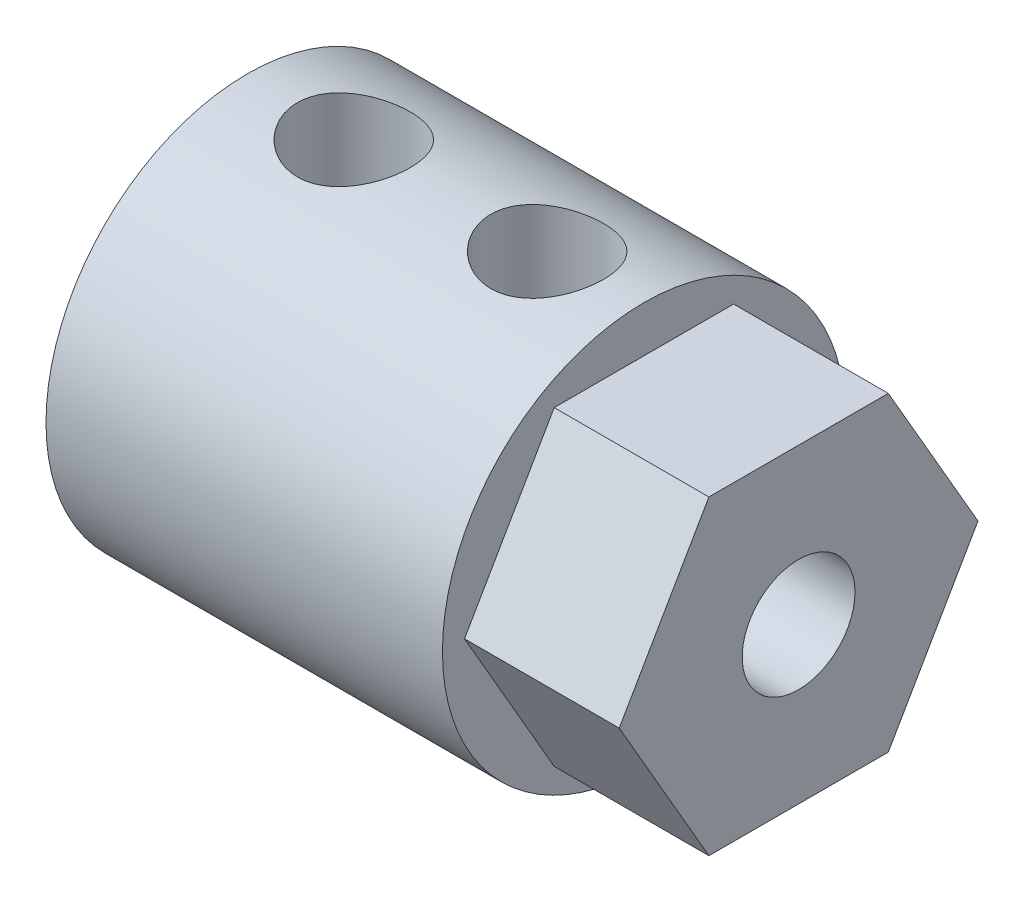
ISO-10303-21;
HEADER;
FILE_DESCRIPTION(('STEP AP214'),'2;1');
FILE_NAME('part.step','',(''),(''),'','','');
FILE_SCHEMA(('AUTOMOTIVE_DESIGN { 1 0 10303 214 1 1 1 1 }'));
ENDSEC;
DATA;
#1=APPLICATION_CONTEXT('core data for automotive mechanical design processes');
#2=APPLICATION_PROTOCOL_DEFINITION('international standard','automotive_design',2000,#1);
#3=PRODUCT_CONTEXT('',#1,'mechanical');
#4=PRODUCT('Part','Part','',(#3));
#5=PRODUCT_RELATED_PRODUCT_CATEGORY('part','',(#4));
#6=PRODUCT_DEFINITION_FORMATION('','',#4);
#7=PRODUCT_DEFINITION_CONTEXT('part definition',#1,'design');
#8=PRODUCT_DEFINITION('design','',#6,#7);
#9=PRODUCT_DEFINITION_SHAPE('','',#8);
#10=(LENGTH_UNIT() NAMED_UNIT(*) SI_UNIT(.MILLI.,.METRE.));
#11=(NAMED_UNIT(*) PLANE_ANGLE_UNIT() SI_UNIT($,.RADIAN.));
#12=(NAMED_UNIT(*) SI_UNIT($,.STERADIAN.) SOLID_ANGLE_UNIT());
#13=UNCERTAINTY_MEASURE_WITH_UNIT(LENGTH_MEASURE(1.E-05),#10,'distance_accuracy_value','');
#14=(GEOMETRIC_REPRESENTATION_CONTEXT(3) GLOBAL_UNCERTAINTY_ASSIGNED_CONTEXT((#13)) GLOBAL_UNIT_ASSIGNED_CONTEXT((#10,
#11,#12)) REPRESENTATION_CONTEXT('',''));
#15=CARTESIAN_POINT('',(0.,0.,0.));
#16=DIRECTION('',(0.,0.,1.));
#17=DIRECTION('',(1.,0.,0.));
#18=AXIS2_PLACEMENT_3D('',#15,#16,#17);
#19=CARTESIAN_POINT('',(-15.621,0.,0.));
#20=DIRECTION('',(1.,0.,0.));
#21=DIRECTION('',(0.,0.,1.));
#22=AXIS2_PLACEMENT_3D('',#19,#20,#21);
#23=CYLINDRICAL_SURFACE('',#22,7.9375);
#24=CARTESIAN_POINT('',(-15.621,0.,0.));
#25=DIRECTION('',(1.,0.,0.));
#26=DIRECTION('',(0.,0.,-1.));
#27=AXIS2_PLACEMENT_3D('',#24,#25,#26);
#28=CIRCLE('',#27,7.9375);
#29=CARTESIAN_POINT('',(-15.621,0.,-7.9375));
#30=VERTEX_POINT('',#29);
#31=EDGE_CURVE('E224',#30,#30,#28,.T.);
#32=ORIENTED_EDGE('',*,*,#31,.T.);
#33=EDGE_LOOP('',(#32));
#34=FACE_BOUND('',#33,.T.);
#35=CARTESIAN_POINT('',(0.,0.,0.));
#36=DIRECTION('',(1.,0.,0.));
#37=DIRECTION('',(0.,0.,-1.));
#38=AXIS2_PLACEMENT_3D('',#35,#36,#37);
#39=CIRCLE('',#38,7.9375);
#40=CARTESIAN_POINT('',(0.,0.,-7.9375));
#41=VERTEX_POINT('',#40);
#42=EDGE_CURVE('E222',#41,#41,#39,.T.);
#43=ORIENTED_EDGE('',*,*,#42,.F.);
#44=EDGE_LOOP('',(#43));
#45=FACE_BOUND('',#44,.T.);
#46=CARTESIAN_POINT('',(-1.5875,7.9375,0.));
#47=CARTESIAN_POINT('',(-1.587502398111,7.93749841297143,0.122289434384592));
#48=CARTESIAN_POINT('',(-1.59762687587564,7.93464640374844,0.24460380457482));
#49=CARTESIAN_POINT('',(-1.63777621242458,7.92354674957216,0.485694032880113));
#50=CARTESIAN_POINT('',(-1.66780922620723,7.91529689355351,0.60446842009344));
#51=CARTESIAN_POINT('',(-1.74671141204331,7.89430957331477,0.834964927090246));
#52=CARTESIAN_POINT('',(-1.79555492267656,7.88157822480584,0.946696414251323));
#53=CARTESIAN_POINT('',(-1.91059251715217,7.85296472583047,1.16038287672983));
#54=CARTESIAN_POINT('',(-1.97678821842334,7.83708228167832,1.26233693946535));
#55=CARTESIAN_POINT('',(-2.12642117544705,7.8034232726709,1.45615831068255));
#56=CARTESIAN_POINT('',(-2.21021716527189,7.78561177508401,1.54774260219952));
#57=CARTESIAN_POINT('',(-2.39190611080195,7.75032012250063,1.71575936348891));
#58=CARTESIAN_POINT('',(-2.48980108186053,7.73284001527906,1.79218966338291));
#59=CARTESIAN_POINT('',(-2.69922041664797,7.6998283677456,1.92915068426256));
#60=CARTESIAN_POINT('',(-2.81097026361879,7.68434065377252,1.98934817384267));
#61=CARTESIAN_POINT('',(-3.04350943858364,7.65758432116579,2.08998548271767));
#62=CARTESIAN_POINT('',(-3.16429690220516,7.64631483521622,2.13042936410227));
#63=CARTESIAN_POINT('',(-3.4083305685353,7.62963290719132,2.18941388458174));
#64=CARTESIAN_POINT('',(-3.53144225208111,7.62408261047198,2.20847108866752));
#65=CARTESIAN_POINT('',(-3.77923081639445,7.61905627706929,2.22575284029697));
#66=CARTESIAN_POINT('',(-3.90390736649889,7.61957897802232,2.22398171731976));
#67=CARTESIAN_POINT('',(-4.14719088560424,7.62651666080719,2.20006548936518));
#68=CARTESIAN_POINT('',(-4.26586618923935,7.63274845031214,2.17855378119358));
#69=CARTESIAN_POINT('',(-4.49785161633767,7.65010764560777,2.1167849227819));
#70=CARTESIAN_POINT('',(-4.61116127104343,7.66123547825911,2.0765261380634));
#71=CARTESIAN_POINT('',(-4.83081036825138,7.68728817952527,1.97790928071366));
#72=CARTESIAN_POINT('',(-4.93704749092035,7.7022578670799,1.9193356539467));
#73=CARTESIAN_POINT('',(-5.13840348293651,7.73428447505437,1.78590192518265));
#74=CARTESIAN_POINT('',(-5.23351995715069,7.75134184349961,1.71103832459554));
#75=CARTESIAN_POINT('',(-5.41354369025916,7.78637689551321,1.54394699344826));
#76=CARTESIAN_POINT('',(-5.49795804958312,7.80436556600566,1.45118970763094));
#77=CARTESIAN_POINT('',(-5.6501397189066,7.83868636973626,1.25261337987339));
#78=CARTESIAN_POINT('',(-5.71790623276662,7.85501842372916,1.14679371362257));
#79=CARTESIAN_POINT('',(-5.83511680307549,7.88430398837012,0.924282134935336));
#80=CARTESIAN_POINT('',(-5.88446390275543,7.89723951739796,0.807536626467184));
#81=CARTESIAN_POINT('',(-5.96268456648585,7.91814489748872,0.566959944436843));
#82=CARTESIAN_POINT('',(-5.99156307940385,7.92611594879985,0.443130491451456));
#83=CARTESIAN_POINT('',(-6.02723492193407,7.93600949314591,0.196101124919305));
#84=CARTESIAN_POINT('',(-6.03469753237385,7.93811522289107,0.0730050493447829));
#85=CARTESIAN_POINT('',(-6.02918471081962,7.93657184147866,-0.172682576611987));
#86=CARTESIAN_POINT('',(-6.01621162593874,7.9329233912093,-0.295274183312975));
#87=CARTESIAN_POINT('',(-5.97074190820065,7.92040063357283,-0.534031051075131));
#88=CARTESIAN_POINT('',(-5.93862546036324,7.91162815516481,-0.650274552968655));
#89=CARTESIAN_POINT('',(-5.85622831272659,7.88985924413703,-0.875707417570524));
#90=CARTESIAN_POINT('',(-5.80594554945293,7.87686233168934,-0.984895977260915));
#91=CARTESIAN_POINT('',(-5.68744786332019,7.84766549897653,-1.19566699168485));
#92=CARTESIAN_POINT('',(-5.61887794200882,7.83140394678713,-1.29704110514929));
#93=CARTESIAN_POINT('',(-5.46619270156045,7.79755361828553,-1.48707642789286));
#94=CARTESIAN_POINT('',(-5.38207398796685,7.77996455266095,-1.57573485369032));
#95=CARTESIAN_POINT('',(-5.19754542583976,7.74475574438945,-1.74069277960931));
#96=CARTESIAN_POINT('',(-5.09670785802765,7.72715229446269,-1.81651823498446));
#97=CARTESIAN_POINT('',(-4.88336192472095,7.69450550823917,-1.95019062299679));
#98=CARTESIAN_POINT('',(-4.77085399552126,7.67946207629195,-2.00803822741068));
#99=CARTESIAN_POINT('',(-4.53786166057827,7.65381415280244,-2.10368464486661));
#100=CARTESIAN_POINT('',(-4.41742523518426,7.64318537493625,-2.14159346282923));
#101=CARTESIAN_POINT('',(-4.17153384499789,7.62758676285093,-2.19651019045085));
#102=CARTESIAN_POINT('',(-4.04608033702155,7.62261529808532,-2.21352412253003));
#103=CARTESIAN_POINT('',(-3.79859578431933,7.61904009677965,-2.22579634337424));
#104=CARTESIAN_POINT('',(-3.67660541699017,7.62021218162667,-2.22182051126848));
#105=CARTESIAN_POINT('',(-3.43510880845293,7.6282616577072,-2.19402262129698));
#106=CARTESIAN_POINT('',(-3.31560249051765,7.63513887245171,-2.17020117735789));
#107=CARTESIAN_POINT('',(-3.08354127422839,7.65368348699787,-2.10385266467513));
#108=CARTESIAN_POINT('',(-2.9709315866381,7.66530524566887,-2.06150355593924));
#109=CARTESIAN_POINT('',(-2.75432773685296,7.69202662666681,-1.95943946415649));
#110=CARTESIAN_POINT('',(-2.65033505215382,7.70712684374916,-1.89972151088259));
#111=CARTESIAN_POINT('',(-2.45030033200027,7.73971061356866,-1.76236009307517));
#112=CARTESIAN_POINT('',(-2.35462190181763,7.75725523110183,-1.68420156559259));
#113=CARTESIAN_POINT('',(-2.17749007152221,7.79242812441293,-1.51313678633054));
#114=CARTESIAN_POINT('',(-2.09604021868082,7.81005641993032,-1.42022686792809));
#115=CARTESIAN_POINT('',(-1.9477194350652,7.84392363107764,-1.21957214778867));
#116=CARTESIAN_POINT('',(-1.88125116374675,7.86011833953724,-1.11152155583987));
#117=CARTESIAN_POINT('',(-1.76752470486395,7.88879340490492,-0.885326940704654));
#118=CARTESIAN_POINT('',(-1.72025544990178,7.90127590062755,-0.767188780236336));
#119=CARTESIAN_POINT('',(-1.65169956819758,7.91970568495603,-0.541420338472193));
#120=CARTESIAN_POINT('',(-1.62768411699767,7.92632747266372,-0.43466625717126));
#121=CARTESIAN_POINT('',(-1.59558423476692,7.93522507389311,-0.218614550898743));
#122=CARTESIAN_POINT('',(-1.58749785627538,7.93750141868005,-0.109317238511546));
#123=CARTESIAN_POINT('',(-1.5875,7.9375,0.));
#124=B_SPLINE_CURVE_WITH_KNOTS('',3,(#46,#47,#48,#49,#50,#51,#52,#53,#54,#55,#56,#57,#58,#59,
#60,#61,#62,#63,#64,#65,#66,#67,#68,#69,#70,#71,#72,#73,#74,#75,#76,#77,#78,#79,#80,#81,#82,#83,
#84,#85,#86,#87,#88,#89,#90,#91,#92,#93,#94,#95,#96,#97,#98,#99,#100,#101,#102,#103,#104,#105,
#106,#107,#108,#109,#110,#111,#112,#113,#114,#115,#116,#117,#118,#119,#120,#121,#122,#123),
.UNSPECIFIED.,.T.,.F.,(4,2,2,2,2,2,2,2,2,2,2,2,2,2,2,2,2,2,2,2,2,2,2,2,2,2,2,2,2,2,2,2,2,2,2,2,
2,2,4),(0.,0.366467159375124,0.733084525040348,1.09920351015625,1.46535663402202,
1.83985902232483,2.2144149964241,2.59615815397004,2.97782277758453,3.35005588802573,
3.72221162561857,4.08282869463252,4.44347721021375,4.80854112418707,5.1736835202881,
5.55201589839114,5.93036636572644,6.310681224658,6.69090410017637,7.05910769208849,
7.42726899757706,7.78835148351941,8.14947499698045,8.51819575160419,8.88699709692384,
9.26734918477582,9.64768705833693,10.0259039435842,10.4040117918163,10.7684207028235,
11.1328183412108,11.4937902180729,11.8548238606708,12.2274771315308,12.6002231749544,
12.9820329052775,13.3636222254502,13.6912554080105,14.0188485322216),.UNSPECIFIED.);
#125=CARTESIAN_POINT('',(-1.5875,7.9375,0.));
#126=VERTEX_POINT('',#125);
#127=EDGE_CURVE('E143',#126,#126,#124,.T.);
#128=ORIENTED_EDGE('',*,*,#127,.T.);
#129=EDGE_LOOP('',(#128));
#130=FACE_BOUND('',#129,.T.);
#131=CARTESIAN_POINT('',(-9.2075,7.9375,0.));
#132=CARTESIAN_POINT('',(-9.207502398111,7.93749841297143,0.122289434384593));
#133=CARTESIAN_POINT('',(-9.21762687587564,7.93464640374844,0.24460380457482));
#134=CARTESIAN_POINT('',(-9.25777621242458,7.92354674957216,0.485694032880113));
#135=CARTESIAN_POINT('',(-9.28780922620723,7.91529689355351,0.60446842009344));
#136=CARTESIAN_POINT('',(-9.36671141204331,7.89430957331477,0.834964927090245));
#137=CARTESIAN_POINT('',(-9.41555492267656,7.88157822480584,0.946696414251323));
#138=CARTESIAN_POINT('',(-9.53059251715217,7.85296472583047,1.16038287672983));
#139=CARTESIAN_POINT('',(-9.59678821842334,7.83708228167832,1.26233693946535));
#140=CARTESIAN_POINT('',(-9.74642117544705,7.8034232726709,1.45615831068255));
#141=CARTESIAN_POINT('',(-9.83021716527189,7.78561177508401,1.54774260219952));
#142=CARTESIAN_POINT('',(-10.0119061108019,7.75032012250063,1.7157593634889));
#143=CARTESIAN_POINT('',(-10.1098010818605,7.73284001527906,1.79218966338291));
#144=CARTESIAN_POINT('',(-10.319220416648,7.6998283677456,1.92915068426256));
#145=CARTESIAN_POINT('',(-10.4309702636188,7.68434065377252,1.98934817384266));
#146=CARTESIAN_POINT('',(-10.6635094385836,7.65758432116579,2.08998548271767));
#147=CARTESIAN_POINT('',(-10.7842969022052,7.64631483521622,2.13042936410227));
#148=CARTESIAN_POINT('',(-11.0283305685353,7.62963290719132,2.18941388458174));
#149=CARTESIAN_POINT('',(-11.1514422520811,7.62408261047198,2.20847108866752));
#150=CARTESIAN_POINT('',(-11.3992308163944,7.61905627706929,2.22575284029697));
#151=CARTESIAN_POINT('',(-11.5239073664989,7.61957897802232,2.22398171731976));
#152=CARTESIAN_POINT('',(-11.7671908856042,7.62651666080719,2.20006548936518));
#153=CARTESIAN_POINT('',(-11.8858661892394,7.63274845031214,2.17855378119358));
#154=CARTESIAN_POINT('',(-12.1178516163377,7.65010764560777,2.1167849227819));
#155=CARTESIAN_POINT('',(-12.2311612710434,7.66123547825911,2.0765261380634));
#156=CARTESIAN_POINT('',(-12.4508103682514,7.68728817952527,1.97790928071366));
#157=CARTESIAN_POINT('',(-12.5570474909203,7.7022578670799,1.9193356539467));
#158=CARTESIAN_POINT('',(-12.7584034829365,7.73428447505437,1.78590192518265));
#159=CARTESIAN_POINT('',(-12.8535199571507,7.75134184349961,1.71103832459554));
#160=CARTESIAN_POINT('',(-13.0335436902592,7.78637689551321,1.54394699344827));
#161=CARTESIAN_POINT('',(-13.1179580495831,7.80436556600566,1.45118970763094));
#162=CARTESIAN_POINT('',(-13.2701397189066,7.83868636973626,1.25261337987339));
#163=CARTESIAN_POINT('',(-13.3379062327666,7.85501842372916,1.14679371362257));
#164=CARTESIAN_POINT('',(-13.4551168030755,7.88430398837012,0.924282134935336));
#165=CARTESIAN_POINT('',(-13.5044639027554,7.89723951739796,0.807536626467184));
#166=CARTESIAN_POINT('',(-13.5826845664859,7.91814489748872,0.566959944436844));
#167=CARTESIAN_POINT('',(-13.6115630794039,7.92611594879985,0.443130491451456));
#168=CARTESIAN_POINT('',(-13.6472349219341,7.93600949314591,0.196101124919305));
#169=CARTESIAN_POINT('',(-13.6546975323738,7.93811522289107,0.0730050493447832));
#170=CARTESIAN_POINT('',(-13.6491847108196,7.93657184147866,-0.172682576611986));
#171=CARTESIAN_POINT('',(-13.6362116259387,7.9329233912093,-0.295274183312975));
#172=CARTESIAN_POINT('',(-13.5907419082007,7.92040063357283,-0.534031051075131));
#173=CARTESIAN_POINT('',(-13.5586254603632,7.91162815516481,-0.650274552968655));
#174=CARTESIAN_POINT('',(-13.4762283127266,7.88985924413703,-0.875707417570524));
#175=CARTESIAN_POINT('',(-13.4259455494529,7.87686233168934,-0.984895977260914));
#176=CARTESIAN_POINT('',(-13.3074478633202,7.84766549897653,-1.19566699168485));
#177=CARTESIAN_POINT('',(-13.2388779420088,7.83140394678713,-1.29704110514929));
#178=CARTESIAN_POINT('',(-13.0861927015605,7.79755361828553,-1.48707642789286));
#179=CARTESIAN_POINT('',(-13.0020739879669,7.77996455266095,-1.57573485369032));
#180=CARTESIAN_POINT('',(-12.8175454258398,7.74475574438945,-1.74069277960931));
#181=CARTESIAN_POINT('',(-12.7167078580276,7.72715229446269,-1.81651823498446));
#182=CARTESIAN_POINT('',(-12.5033619247209,7.69450550823917,-1.95019062299679));
#183=CARTESIAN_POINT('',(-12.3908539955213,7.67946207629195,-2.00803822741068));
#184=CARTESIAN_POINT('',(-12.1578616605783,7.65381415280244,-2.10368464486661));
#185=CARTESIAN_POINT('',(-12.0374252351843,7.64318537493625,-2.14159346282923));
#186=CARTESIAN_POINT('',(-11.7915338449979,7.62758676285093,-2.19651019045085));
#187=CARTESIAN_POINT('',(-11.6660803370216,7.62261529808532,-2.21352412253003));
#188=CARTESIAN_POINT('',(-11.4185957843193,7.61904009677965,-2.22579634337424));
#189=CARTESIAN_POINT('',(-11.2966054169902,7.62021218162667,-2.22182051126848));
#190=CARTESIAN_POINT('',(-11.0551088084529,7.6282616577072,-2.19402262129698));
#191=CARTESIAN_POINT('',(-10.9356024905177,7.63513887245171,-2.17020117735789));
#192=CARTESIAN_POINT('',(-10.7035412742284,7.65368348699787,-2.10385266467513));
#193=CARTESIAN_POINT('',(-10.5909315866381,7.66530524566887,-2.06150355593924));
#194=CARTESIAN_POINT('',(-10.374327736853,7.69202662666681,-1.95943946415649));
#195=CARTESIAN_POINT('',(-10.2703350521538,7.70712684374916,-1.89972151088259));
#196=CARTESIAN_POINT('',(-10.0703003320003,7.73971061356866,-1.76236009307517));
#197=CARTESIAN_POINT('',(-9.97462190181763,7.75725523110183,-1.68420156559259));
#198=CARTESIAN_POINT('',(-9.79749007152221,7.79242812441293,-1.51313678633054));
#199=CARTESIAN_POINT('',(-9.71604021868082,7.81005641993032,-1.42022686792809));
#200=CARTESIAN_POINT('',(-9.5677194350652,7.84392363107764,-1.21957214778867));
#201=CARTESIAN_POINT('',(-9.50125116374675,7.86011833953724,-1.11152155583987));
#202=CARTESIAN_POINT('',(-9.38752470486395,7.88879340490492,-0.885326940704655));
#203=CARTESIAN_POINT('',(-9.34025544990178,7.90127590062755,-0.767188780236337));
#204=CARTESIAN_POINT('',(-9.27169956819758,7.91970568495603,-0.541420338472194));
#205=CARTESIAN_POINT('',(-9.24768411699767,7.92632747266372,-0.434666257171261));
#206=CARTESIAN_POINT('',(-9.21558423476692,7.93522507389311,-0.218614550898744));
#207=CARTESIAN_POINT('',(-9.20749785627538,7.93750141868005,-0.109317238511547));
#208=CARTESIAN_POINT('',(-9.2075,7.9375,0.));
#209=B_SPLINE_CURVE_WITH_KNOTS('',3,(#131,#132,#133,#134,#135,#136,#137,#138,#139,#140,#141,
#142,#143,#144,#145,#146,#147,#148,#149,#150,#151,#152,#153,#154,#155,#156,#157,#158,#159,#160,
#161,#162,#163,#164,#165,#166,#167,#168,#169,#170,#171,#172,#173,#174,#175,#176,#177,#178,#179,
#180,#181,#182,#183,#184,#185,#186,#187,#188,#189,#190,#191,#192,#193,#194,#195,#196,#197,#198,
#199,#200,#201,#202,#203,#204,#205,#206,#207,#208),.UNSPECIFIED.,.T.,.F.,(4,2,2,2,2,2,2,2,2,2,2,
2,2,2,2,2,2,2,2,2,2,2,2,2,2,2,2,2,2,2,2,2,2,2,2,2,2,2,4),(0.,0.366467159375124,
0.733084525040348,1.09920351015625,1.46535663402202,1.83985902232483,2.2144149964241,
2.59615815397004,2.97782277758453,3.35005588802573,3.72221162561857,4.08282869463252,
4.44347721021375,4.80854112418707,5.1736835202881,5.55201589839114,5.93036636572644,
6.310681224658,6.69090410017637,7.05910769208849,7.42726899757706,7.78835148351941,
8.14947499698045,8.51819575160419,8.88699709692384,9.26734918477582,9.64768705833692,
10.0259039435842,10.4040117918163,10.7684207028235,11.1328183412108,11.4937902180729,
11.8548238606708,12.2274771315308,12.6002231749544,12.9820329052775,13.3636222254502,
13.6912554080105,14.0188485322216),.UNSPECIFIED.);
#210=CARTESIAN_POINT('',(-9.2075,7.9375,0.));
#211=VERTEX_POINT('',#210);
#212=EDGE_CURVE('E174',#211,#211,#209,.T.);
#213=ORIENTED_EDGE('',*,*,#212,.T.);
#214=EDGE_LOOP('',(#213));
#215=FACE_BOUND('',#214,.T.);
#216=ADVANCED_FACE('F43',(#34,#45,#130,#215),#23,.T.);
#217=CARTESIAN_POINT('',(-15.621,0.,0.));
#218=DIRECTION('',(1.,0.,0.));
#219=DIRECTION('',(0.,0.,1.));
#220=AXIS2_PLACEMENT_3D('',#217,#218,#219);
#221=CYLINDRICAL_SURFACE('',#220,3.2639);
#222=CARTESIAN_POINT('',(-3.81,2.39030060034298,2.2225));
#223=CARTESIAN_POINT('',(-3.86387681861353,2.39029751716212,2.22250164306595));
#224=CARTESIAN_POINT('',(-3.91773845668203,2.39213071298594,2.22053678683314));
#225=CARTESIAN_POINT('',(-4.02494702809361,2.39934857483477,2.21273503878008));
#226=CARTESIAN_POINT('',(-4.07829381339239,2.4047342332002,2.2068970650454));
#227=CARTESIAN_POINT('',(-4.23699002756019,2.42588326346957,2.18371102633077));
#228=CARTESIAN_POINT('',(-4.34090732766237,2.44663804441049,2.16069112531605));
#229=CARTESIAN_POINT('',(-4.5409605126561,2.49769801818942,2.1014344738383));
#230=CARTESIAN_POINT('',(-4.63716510134079,2.52790338207168,2.06533528073356));
#231=CARTESIAN_POINT('',(-4.82199185747863,2.59426863384097,1.98133330962816));
#232=CARTESIAN_POINT('',(-4.91061293079026,2.63042937877029,1.93342883222908));
#233=CARTESIAN_POINT('',(-5.09362032816993,2.71171973668246,1.81806779220596));
#234=CARTESIAN_POINT('',(-5.18657569992676,2.75734854327609,1.74869430189853));
#235=CARTESIAN_POINT('',(-5.3607914885878,2.84832951759792,1.59623415100642));
#236=CARTESIAN_POINT('',(-5.44203851577277,2.89368131268224,1.5131320196709));
#237=CARTESIAN_POINT('',(-5.60295900772415,2.98719173096089,1.32019416449024));
#238=CARTESIAN_POINT('',(-5.68046893060544,3.03470940930687,1.2082125628379));
#239=CARTESIAN_POINT('',(-5.81482049963141,3.11931496425914,0.968977638102178));
#240=CARTESIAN_POINT('',(-5.87170082899154,3.15642233165939,0.841753499280781));
#241=CARTESIAN_POINT('',(-5.94968186708383,3.20798497031896,0.610037351910737));
#242=CARTESIAN_POINT('',(-5.97622201597288,3.22581145431039,0.508112525674404));
#243=CARTESIAN_POINT('',(-6.01463822381124,3.25173183658252,0.30034638065822));
#244=CARTESIAN_POINT('',(-6.0265255990578,3.2598332453858,0.194508149342579));
#245=CARTESIAN_POINT('',(-6.03497838669641,3.26558670252435,-0.0182487258031895));
#246=CARTESIAN_POINT('',(-6.03151751530509,3.26322082571014,-0.125168909922686));
#247=CARTESIAN_POINT('',(-6.00942165359198,3.24821918218687,-0.336698894486105));
#248=CARTESIAN_POINT('',(-5.99078222924205,3.23558041451607,-0.44130801063722));
#249=CARTESIAN_POINT('',(-5.9398295096798,3.20146247619827,-0.643429241760701));
#250=CARTESIAN_POINT('',(-5.90777927436546,3.18015358541928,-0.741037675775122));
#251=CARTESIAN_POINT('',(-5.83143327006727,3.13031864942995,-0.929325463827257));
#252=CARTESIAN_POINT('',(-5.78713517056554,3.10179123076919,-1.02000349495551));
#253=CARTESIAN_POINT('',(-5.68210832485672,3.03586328663528,-1.20293986056559));
#254=CARTESIAN_POINT('',(-5.62009047445614,2.99782509199416,-1.29422452830014));
#255=CARTESIAN_POINT('',(-5.4842734004816,2.91782698130799,-1.46570906304054));
#256=CARTESIAN_POINT('',(-5.41046064806107,2.87586258507,-1.54589600135202));
#257=CARTESIAN_POINT('',(-5.23880503297432,2.78368336992229,-1.70709018645584));
#258=CARTESIAN_POINT('',(-5.13901027469807,2.73327894501512,-1.78591862722644));
#259=CARTESIAN_POINT('',(-4.92610956542356,2.63633546062852,-1.92614467823464));
#260=CARTESIAN_POINT('',(-4.8130105732286,2.58979440194658,-1.98755134411938));
#261=CARTESIAN_POINT('',(-4.60287409551625,2.51692976605818,-2.07862319301861));
#262=CARTESIAN_POINT('',(-4.50836901885494,2.48842814486749,-2.11236098791731));
#263=CARTESIAN_POINT('',(-4.31350321206215,2.44093738649646,-2.16706984520766));
#264=CARTESIAN_POINT('',(-4.21315361484031,2.4219307843843,-2.18806436272226));
#265=CARTESIAN_POINT('',(-4.00800115894879,2.39631941762942,-2.21609711209024));
#266=CARTESIAN_POINT('',(-3.90316802929383,2.38981991348072,-2.22301691777719));
#267=CARTESIAN_POINT('',(-3.69364554010754,2.39083751520441,-2.22192260819448));
#268=CARTESIAN_POINT('',(-3.58895617793243,2.39835435977746,-2.21390877132478));
#269=CARTESIAN_POINT('',(-3.39534714993433,2.42431464368734,-2.18541503596635));
#270=CARTESIAN_POINT('',(-3.30600055922041,2.44139896573962,-2.16647827759457));
#271=CARTESIAN_POINT('',(-3.13193124323293,2.48317543867991,-2.11846510552193));
#272=CARTESIAN_POINT('',(-3.04721291860546,2.50787468672347,-2.08937922943731));
#273=CARTESIAN_POINT('',(-2.84602577341292,2.5748995454653,-2.00671051110969));
#274=CARTESIAN_POINT('',(-2.73262986598745,2.62013386390762,-1.94800221309072));
#275=CARTESIAN_POINT('',(-2.51865038105588,2.71512442704127,-1.81327308538944));
#276=CARTESIAN_POINT('',(-2.41809125671433,2.76488900163698,-1.7372199605789));
#277=CARTESIAN_POINT('',(-2.22960819170821,2.86438428060038,-1.56784544891095));
#278=CARTESIAN_POINT('',(-2.14188732809697,2.91410415173744,-1.47429089917192));
#279=CARTESIAN_POINT('',(-1.98284649256078,3.00797601331659,-1.27182262198244));
#280=CARTESIAN_POINT('',(-1.91150080442577,3.05213668420089,-1.16293341673665));
#281=CARTESIAN_POINT('',(-1.79870992576815,3.12366488597408,-0.951800831739676));
#282=CARTESIAN_POINT('',(-1.75421733057617,3.1526187359081,-0.851727756736225));
#283=CARTESIAN_POINT('',(-1.68004093773573,3.20148086126667,-0.644130252923867));
#284=CARTESIAN_POINT('',(-1.65034767665006,3.22139491646099,-0.53661063604242));
#285=CARTESIAN_POINT('',(-1.60725477041928,3.25044100717349,-0.316332971593631));
#286=CARTESIAN_POINT('',(-1.5939353468613,3.25951995112598,-0.203551920591964));
#287=CARTESIAN_POINT('',(-1.58473117240477,3.26578394435276,0.0230473007282234));
#288=CARTESIAN_POINT('',(-1.5888424303553,3.26297171638166,0.136865227675214));
#289=CARTESIAN_POINT('',(-1.61315228406288,3.24647655831156,0.352356081485915));
#290=CARTESIAN_POINT('',(-1.63199964641102,3.23370692855918,0.45425785621263));
#291=CARTESIAN_POINT('',(-1.68313948316801,3.19948628740756,0.653080343731994));
#292=CARTESIAN_POINT('',(-1.71543474132803,3.17803347859227,0.750000020547386));
#293=CARTESIAN_POINT('',(-1.79400328334478,3.12679526171725,0.9415468883208));
#294=CARTESIAN_POINT('',(-1.84088824978863,3.09665058725049,1.03582433338721));
#295=CARTESIAN_POINT('',(-1.94634087831189,3.0306881826343,1.2153736697172));
#296=CARTESIAN_POINT('',(-2.00491141445185,2.99486905730355,1.30064333761535));
#297=CARTESIAN_POINT('',(-2.14242220796437,2.91389475700256,1.47404175906904));
#298=CARTESIAN_POINT('',(-2.22311796319132,2.86815787793437,1.56050331391021));
#299=CARTESIAN_POINT('',(-2.39706599510535,2.77569222982111,1.71960778163205));
#300=CARTESIAN_POINT('',(-2.49034607990893,2.72896146285769,1.79221920625993));
#301=CARTESIAN_POINT('',(-2.64543245235382,2.65843375448745,1.89414779256364));
#302=CARTESIAN_POINT('',(-2.70338861081746,2.63346416446701,1.92860177819981));
#303=CARTESIAN_POINT('',(-2.82288433259694,2.58552432263349,1.99240982757592));
#304=CARTESIAN_POINT('',(-2.88442493443367,2.5625546551155,2.02176240337211));
#305=CARTESIAN_POINT('',(-3.01063249425583,2.51972580178605,2.07489455039068));
#306=CARTESIAN_POINT('',(-3.07528731929103,2.49985564954387,2.09869392488008));
#307=CARTESIAN_POINT('',(-3.20752239176595,2.46423799418168,2.14040351899111));
#308=CARTESIAN_POINT('',(-3.27509996719961,2.44848681456931,2.15831899411596));
#309=CARTESIAN_POINT('',(-3.41955893246682,2.42084169414365,2.18930308664168));
#310=CARTESIAN_POINT('',(-3.49669293452559,2.40949428441096,2.20170389939372));
#311=CARTESIAN_POINT('',(-3.65256269209018,2.39422803151017,2.21829890001868));
#312=CARTESIAN_POINT('',(-3.73129754287663,2.39030510420782,2.22249759983364));
#313=CARTESIAN_POINT('',(-3.81,2.39030060034298,2.2225));
#314=B_SPLINE_CURVE_WITH_KNOTS('',3,(#222,#223,#224,#225,#226,#227,#228,#229,#230,#231,#232,
#233,#234,#235,#236,#237,#238,#239,#240,#241,#242,#243,#244,#245,#246,#247,#248,#249,#250,#251,
#252,#253,#254,#255,#256,#257,#258,#259,#260,#261,#262,#263,#264,#265,#266,#267,#268,#269,#270,
#271,#272,#273,#274,#275,#276,#277,#278,#279,#280,#281,#282,#283,#284,#285,#286,#287,#288,#289,
#290,#291,#292,#293,#294,#295,#296,#297,#298,#299,#300,#301,#302,#303,#304,#305,#306,#307,#308,
#309,#310,#311,#312,#313),.UNSPECIFIED.,.T.,.F.,(4,2,2,2,2,2,2,2,2,2,2,2,2,2,2,2,2,2,2,2,2,2,2,
2,2,2,2,2,2,2,2,2,2,2,2,2,2,2,2,2,2,2,2,2,2,4),(0.,0.161533348948191,0.323111839539057,
0.646528362355942,0.966637754458413,1.28679325400589,1.65935660879822,2.03234270402694,
2.46268949816965,2.89222511133065,3.21130654066329,3.53014138956571,3.84952245193868,
4.16899684684796,4.48247838740756,4.79601961818765,5.14489759350476,5.49417864560801,
5.90284878139955,6.31130610412828,6.62310792785091,6.93433409872721,7.24816830500536,
7.56199666069789,7.83965668809895,8.11757628258677,8.52183015265019,8.92684295725393,
9.33769520708225,9.74789775517685,10.0863332118707,10.4245519773946,10.7644212834151,
11.1042127728326,11.4160516092429,11.7279550292592,12.0552659049741,12.3826573821097,
12.7616441620906,13.141482557887,13.3569334403355,13.5724470589203,13.7871799698808,
14.001720556292,14.2378159869043,14.4737815059671),.UNSPECIFIED.);
#315=CARTESIAN_POINT('',(-3.81,2.39030060034298,2.2225));
#316=VERTEX_POINT('',#315);
#317=EDGE_CURVE('E137',#316,#316,#314,.T.);
#318=ORIENTED_EDGE('',*,*,#317,.F.);
#319=EDGE_LOOP('',(#318));
#320=FACE_BOUND('',#319,.T.);
#321=CARTESIAN_POINT('',(-15.621,0.,0.));
#322=DIRECTION('',(1.,0.,0.));
#323=DIRECTION('',(0.,0.,-1.));
#324=AXIS2_PLACEMENT_3D('',#321,#322,#323);
#325=CIRCLE('',#324,3.2639);
#326=CARTESIAN_POINT('',(-15.621,0.,-3.2639));
#327=VERTEX_POINT('',#326);
#328=EDGE_CURVE('E180',#327,#327,#325,.T.);
#329=ORIENTED_EDGE('',*,*,#328,.F.);
#330=EDGE_LOOP('',(#329));
#331=FACE_BOUND('',#330,.T.);
#332=CARTESIAN_POINT('',(0.,0.,0.));
#333=DIRECTION('',(1.,0.,0.));
#334=DIRECTION('',(0.,0.,-1.));
#335=AXIS2_PLACEMENT_3D('',#332,#333,#334);
#336=CIRCLE('',#335,3.2639);
#337=CARTESIAN_POINT('',(0.,0.,-3.2639));
#338=VERTEX_POINT('',#337);
#339=EDGE_CURVE('E11',#338,#338,#336,.F.);
#340=ORIENTED_EDGE('',*,*,#339,.F.);
#341=EDGE_LOOP('',(#340));
#342=FACE_BOUND('',#341,.T.);
#343=CARTESIAN_POINT('',(-11.43,2.39030060034298,2.2225));
#344=CARTESIAN_POINT('',(-11.4838768186135,2.39029751716212,2.22250164306595));
#345=CARTESIAN_POINT('',(-11.537738456682,2.39213071298594,2.22053678683314));
#346=CARTESIAN_POINT('',(-11.6449470280936,2.39934857483477,2.21273503878008));
#347=CARTESIAN_POINT('',(-11.6982938133924,2.4047342332002,2.2068970650454));
#348=CARTESIAN_POINT('',(-11.8569900275602,2.42588326346957,2.18371102633077));
#349=CARTESIAN_POINT('',(-11.9609073276624,2.44663804441049,2.16069112531605));
#350=CARTESIAN_POINT('',(-12.1609605126561,2.49769801818942,2.1014344738383));
#351=CARTESIAN_POINT('',(-12.2571651013408,2.52790338207168,2.06533528073356));
#352=CARTESIAN_POINT('',(-12.4419918574786,2.59426863384097,1.98133330962816));
#353=CARTESIAN_POINT('',(-12.5306129307903,2.63042937877029,1.93342883222908));
#354=CARTESIAN_POINT('',(-12.7136203281699,2.71171973668246,1.81806779220596));
#355=CARTESIAN_POINT('',(-12.8065756999268,2.75734854327609,1.74869430189853));
#356=CARTESIAN_POINT('',(-12.9807914885878,2.84832951759792,1.59623415100642));
#357=CARTESIAN_POINT('',(-13.0620385157728,2.89368131268224,1.5131320196709));
#358=CARTESIAN_POINT('',(-13.2229590077241,2.98719173096089,1.32019416449024));
#359=CARTESIAN_POINT('',(-13.3004689306054,3.03470940930687,1.2082125628379));
#360=CARTESIAN_POINT('',(-13.4348204996314,3.11931496425913,0.96897763810218));
#361=CARTESIAN_POINT('',(-13.4917008289915,3.15642233165939,0.841753499280783));
#362=CARTESIAN_POINT('',(-13.5696818670838,3.20798497031896,0.61003735191074));
#363=CARTESIAN_POINT('',(-13.5962220159729,3.22581145431039,0.508112525674407));
#364=CARTESIAN_POINT('',(-13.6346382238112,3.25173183658252,0.300346380658223));
#365=CARTESIAN_POINT('',(-13.6465255990578,3.2598332453858,0.194508149342582));
#366=CARTESIAN_POINT('',(-13.6549783866964,3.26558670252435,-0.0182487258031864));
#367=CARTESIAN_POINT('',(-13.6515175153051,3.26322082571014,-0.125168909922682));
#368=CARTESIAN_POINT('',(-13.629421653592,3.24821918218687,-0.336698894486102));
#369=CARTESIAN_POINT('',(-13.6107822292421,3.23558041451607,-0.441308010637217));
#370=CARTESIAN_POINT('',(-13.5598295096798,3.20146247619827,-0.643429241760698));
#371=CARTESIAN_POINT('',(-13.5277792743655,3.18015358541928,-0.741037675775119));
#372=CARTESIAN_POINT('',(-13.4514332700673,3.13031864942995,-0.929325463827254));
#373=CARTESIAN_POINT('',(-13.4071351705655,3.10179123076919,-1.02000349495551));
#374=CARTESIAN_POINT('',(-13.3021083248567,3.03586328663528,-1.20293986056559));
#375=CARTESIAN_POINT('',(-13.2400904744561,2.99782509199416,-1.29422452830014));
#376=CARTESIAN_POINT('',(-13.1042734004816,2.91782698130799,-1.46570906304054));
#377=CARTESIAN_POINT('',(-13.0304606480611,2.87586258507,-1.54589600135202));
#378=CARTESIAN_POINT('',(-12.8588050329743,2.7836833699223,-1.70709018645583));
#379=CARTESIAN_POINT('',(-12.7590102746981,2.73327894501512,-1.78591862722644));
#380=CARTESIAN_POINT('',(-12.5461095654236,2.63633546062852,-1.92614467823464));
#381=CARTESIAN_POINT('',(-12.4330105732286,2.58979440194658,-1.98755134411938));
#382=CARTESIAN_POINT('',(-12.2228740955163,2.51692976605818,-2.07862319301861));
#383=CARTESIAN_POINT('',(-12.1283690188549,2.48842814486749,-2.11236098791731));
#384=CARTESIAN_POINT('',(-11.9335032120622,2.44093738649647,-2.16706984520766));
#385=CARTESIAN_POINT('',(-11.8331536148403,2.4219307843843,-2.18806436272226));
#386=CARTESIAN_POINT('',(-11.6280011589488,2.39631941762942,-2.21609711209024));
#387=CARTESIAN_POINT('',(-11.5231680292938,2.38981991348073,-2.22301691777719));
#388=CARTESIAN_POINT('',(-11.3136455401075,2.39083751520441,-2.22192260819448));
#389=CARTESIAN_POINT('',(-11.2089561779324,2.39835435977746,-2.21390877132478));
#390=CARTESIAN_POINT('',(-11.0153471499343,2.42431464368734,-2.18541503596635));
#391=CARTESIAN_POINT('',(-10.9260005592204,2.44139896573962,-2.16647827759457));
#392=CARTESIAN_POINT('',(-10.7519312432329,2.48317543867991,-2.11846510552193));
#393=CARTESIAN_POINT('',(-10.6672129186055,2.50787468672347,-2.08937922943731));
#394=CARTESIAN_POINT('',(-10.4660257734129,2.5748995454653,-2.00671051110969));
#395=CARTESIAN_POINT('',(-10.3526298659874,2.62013386390762,-1.94800221309072));
#396=CARTESIAN_POINT('',(-10.1386503810559,2.71512442704127,-1.81327308538944));
#397=CARTESIAN_POINT('',(-10.0380912567143,2.76488900163698,-1.7372199605789));
#398=CARTESIAN_POINT('',(-9.84960819170821,2.86438428060038,-1.56784544891095));
#399=CARTESIAN_POINT('',(-9.76188732809697,2.91410415173744,-1.47429089917192));
#400=CARTESIAN_POINT('',(-9.60284649256078,3.00797601331659,-1.27182262198243));
#401=CARTESIAN_POINT('',(-9.53150080442577,3.05213668420089,-1.16293341673665));
#402=CARTESIAN_POINT('',(-9.41870992576815,3.12366488597408,-0.951800831739675));
#403=CARTESIAN_POINT('',(-9.37421733057617,3.1526187359081,-0.851727756736224));
#404=CARTESIAN_POINT('',(-9.30004093773572,3.20148086126667,-0.644130252923866));
#405=CARTESIAN_POINT('',(-9.27034767665006,3.22139491646099,-0.53661063604242));
#406=CARTESIAN_POINT('',(-9.22725477041928,3.25044100717349,-0.316332971593631));
#407=CARTESIAN_POINT('',(-9.2139353468613,3.25951995112598,-0.203551920591964));
#408=CARTESIAN_POINT('',(-9.20473117240477,3.26578394435276,0.0230473007282238));
#409=CARTESIAN_POINT('',(-9.2088424303553,3.26297171638166,0.136865227675214));
#410=CARTESIAN_POINT('',(-9.23315228406288,3.24647655831156,0.352356081485914));
#411=CARTESIAN_POINT('',(-9.25199964641102,3.23370692855918,0.454257856212629));
#412=CARTESIAN_POINT('',(-9.30313948316801,3.19948628740756,0.653080343731993));
#413=CARTESIAN_POINT('',(-9.33543474132803,3.17803347859227,0.750000020547385));
#414=CARTESIAN_POINT('',(-9.41400328334478,3.12679526171725,0.9415468883208));
#415=CARTESIAN_POINT('',(-9.46088824978863,3.09665058725049,1.03582433338721));
#416=CARTESIAN_POINT('',(-9.56634087831189,3.0306881826343,1.2153736697172));
#417=CARTESIAN_POINT('',(-9.62491141445185,2.99486905730355,1.30064333761535));
#418=CARTESIAN_POINT('',(-9.76242220796437,2.91389475700256,1.47404175906904));
#419=CARTESIAN_POINT('',(-9.84311796319132,2.86815787793437,1.56050331391021));
#420=CARTESIAN_POINT('',(-10.0170659951054,2.77569222982111,1.71960778163205));
#421=CARTESIAN_POINT('',(-10.1103460799089,2.72896146285769,1.79221920625993));
#422=CARTESIAN_POINT('',(-10.2654324523538,2.65843375448745,1.89414779256364));
#423=CARTESIAN_POINT('',(-10.3233886108175,2.63346416446701,1.92860177819981));
#424=CARTESIAN_POINT('',(-10.4428843325969,2.58552432263349,1.99240982757592));
#425=CARTESIAN_POINT('',(-10.5044249344337,2.5625546551155,2.02176240337211));
#426=CARTESIAN_POINT('',(-10.6306324942558,2.51972580178605,2.07489455039068));
#427=CARTESIAN_POINT('',(-10.695287319291,2.49985564954387,2.09869392488008));
#428=CARTESIAN_POINT('',(-10.8275223917659,2.46423799418168,2.14040351899111));
#429=CARTESIAN_POINT('',(-10.8950999671996,2.44848681456931,2.15831899411596));
#430=CARTESIAN_POINT('',(-11.0395589324668,2.42084169414365,2.18930308664168));
#431=CARTESIAN_POINT('',(-11.1166929345256,2.40949428441096,2.20170389939372));
#432=CARTESIAN_POINT('',(-11.2725626920902,2.39422803151018,2.21829890001868));
#433=CARTESIAN_POINT('',(-11.3512975428766,2.39030510420783,2.22249759983364));
#434=CARTESIAN_POINT('',(-11.43,2.39030060034298,2.2225));
#435=B_SPLINE_CURVE_WITH_KNOTS('',3,(#343,#344,#345,#346,#347,#348,#349,#350,#351,#352,#353,
#354,#355,#356,#357,#358,#359,#360,#361,#362,#363,#364,#365,#366,#367,#368,#369,#370,#371,#372,
#373,#374,#375,#376,#377,#378,#379,#380,#381,#382,#383,#384,#385,#386,#387,#388,#389,#390,#391,
#392,#393,#394,#395,#396,#397,#398,#399,#400,#401,#402,#403,#404,#405,#406,#407,#408,#409,#410,
#411,#412,#413,#414,#415,#416,#417,#418,#419,#420,#421,#422,#423,#424,#425,#426,#427,#428,#429,
#430,#431,#432,#433,#434),.UNSPECIFIED.,.T.,.F.,(4,2,2,2,2,2,2,2,2,2,2,2,2,2,2,2,2,2,2,2,2,2,2,
2,2,2,2,2,2,2,2,2,2,2,2,2,2,2,2,2,2,2,2,2,2,4),(0.,0.161533348948189,0.323111839539057,
0.64652836235594,0.966637754458412,1.28679325400589,1.65935660879822,2.03234270402694,
2.46268949816965,2.89222511133065,3.21130654066329,3.53014138956571,3.84952245193868,
4.16899684684796,4.48247838740756,4.79601961818765,5.14489759350476,5.49417864560801,
5.90284878139954,6.31130610412828,6.62310792785091,6.93433409872721,7.24816830500536,
7.56199666069788,7.83965668809894,8.11757628258677,8.52183015265019,8.92684295725393,
9.33769520708225,9.74789775517686,10.0863332118707,10.4245519773946,10.7644212834151,
11.1042127728326,11.4160516092429,11.7279550292592,12.0552659049741,12.3826573821097,
12.7616441620906,13.141482557887,13.3569334403355,13.5724470589203,13.7871799698808,
14.001720556292,14.2378159869043,14.4737815059671),.UNSPECIFIED.);
#436=CARTESIAN_POINT('',(-11.43,2.39030060034298,2.2225));
#437=VERTEX_POINT('',#436);
#438=EDGE_CURVE('E47',#437,#437,#435,.T.);
#439=ORIENTED_EDGE('',*,*,#438,.F.);
#440=EDGE_LOOP('',(#439));
#441=FACE_BOUND('',#440,.T.);
#442=ADVANCED_FACE('F147',(#320,#331,#342,#441),#221,.F.);
#443=CARTESIAN_POINT('',(6.096,6.1214,-3.53419193781738));
#444=DIRECTION('',(0.,-0.5,0.866025403784439));
#445=DIRECTION('',(0.,0.866025403784439,0.5));
#446=AXIS2_PLACEMENT_3D('',#443,#444,#445);
#447=PLANE('',#446);
#448=DIRECTION('',(0.,-0.866025403784439,-0.5));
#449=VECTOR('',#448,1.);
#450=CARTESIAN_POINT('',(0.,6.1214,-3.53419193781738));
#451=LINE('',#450,#449);
#452=CARTESIAN_POINT('',(0.,6.1214,-3.53419193781738));
#453=VERTEX_POINT('',#452);
#454=CARTESIAN_POINT('',(0.,0.,-7.06838387563475));
#455=VERTEX_POINT('',#454);
#456=EDGE_CURVE('E228',#453,#455,#451,.T.);
#457=ORIENTED_EDGE('',*,*,#456,.F.);
#458=DIRECTION('',(-1.,0.,0.));
#459=VECTOR('',#458,1.);
#460=CARTESIAN_POINT('',(6.096,6.1214,-3.53419193781738));
#461=LINE('',#460,#459);
#462=CARTESIAN_POINT('',(6.096,6.1214,-3.53419193781738));
#463=VERTEX_POINT('',#462);
#464=EDGE_CURVE('E103',#463,#453,#461,.T.);
#465=ORIENTED_EDGE('',*,*,#464,.F.);
#466=DIRECTION('',(0.,-0.866025403784439,-0.5));
#467=VECTOR('',#466,1.);
#468=CARTESIAN_POINT('',(6.096,6.1214,-3.53419193781738));
#469=LINE('',#468,#467);
#470=CARTESIAN_POINT('',(6.096,0.,-7.06838387563475));
#471=VERTEX_POINT('',#470);
#472=EDGE_CURVE('E108',#463,#471,#469,.T.);
#473=ORIENTED_EDGE('',*,*,#472,.T.);
#474=DIRECTION('',(-1.,0.,0.));
#475=VECTOR('',#474,1.);
#476=CARTESIAN_POINT('',(6.096,0.,-7.06838387563475));
#477=LINE('',#476,#475);
#478=EDGE_CURVE('E58',#471,#455,#477,.T.);
#479=ORIENTED_EDGE('',*,*,#478,.T.);
#480=EDGE_LOOP('',(#457,#465,#473,#479));
#481=FACE_BOUND('',#480,.T.);
#482=ADVANCED_FACE('F45',(#481),#447,.F.);
#483=CARTESIAN_POINT('',(6.096,-6.1214,-3.53419193781738));
#484=DIRECTION('',(0.,0.5,0.866025403784439));
#485=DIRECTION('',(0.,0.866025403784439,-0.5));
#486=AXIS2_PLACEMENT_3D('',#483,#484,#485);
#487=PLANE('',#486);
#488=DIRECTION('',(0.,-0.866025403784439,0.5));
#489=VECTOR('',#488,1.);
#490=CARTESIAN_POINT('',(0.,-6.1214,-3.53419193781738));
#491=LINE('',#490,#489);
#492=CARTESIAN_POINT('',(0.,-6.1214,-3.53419193781738));
#493=VERTEX_POINT('',#492);
#494=EDGE_CURVE('E244',#455,#493,#491,.T.);
#495=ORIENTED_EDGE('',*,*,#494,.F.);
#496=ORIENTED_EDGE('',*,*,#478,.F.);
#497=DIRECTION('',(0.,-0.866025403784439,0.5));
#498=VECTOR('',#497,1.);
#499=CARTESIAN_POINT('',(6.096,-6.1214,-3.53419193781738));
#500=LINE('',#499,#498);
#501=CARTESIAN_POINT('',(6.096,-6.1214,-3.53419193781738));
#502=VERTEX_POINT('',#501);
#503=EDGE_CURVE('E232',#471,#502,#500,.T.);
#504=ORIENTED_EDGE('',*,*,#503,.T.);
#505=DIRECTION('',(-1.,0.,0.));
#506=VECTOR('',#505,1.);
#507=CARTESIAN_POINT('',(6.096,-6.1214,-3.53419193781738));
#508=LINE('',#507,#506);
#509=EDGE_CURVE('E133',#502,#493,#508,.T.);
#510=ORIENTED_EDGE('',*,*,#509,.T.);
#511=EDGE_LOOP('',(#495,#496,#504,#510));
#512=FACE_BOUND('',#511,.T.);
#513=ADVANCED_FACE('F250',(#512),#487,.F.);
#514=CARTESIAN_POINT('',(6.096,-6.1214,-3.53419193781738));
#515=DIRECTION('',(0.,1.,0.));
#516=DIRECTION('',(0.,0.,-1.));
#517=AXIS2_PLACEMENT_3D('',#514,#515,#516);
#518=PLANE('',#517);
#519=DIRECTION('',(0.,0.,1.));
#520=VECTOR('',#519,1.);
#521=CARTESIAN_POINT('',(0.,-6.1214,-3.53419193781738));
#522=LINE('',#521,#520);
#523=CARTESIAN_POINT('',(0.,-6.1214,3.53419193781738));
#524=VERTEX_POINT('',#523);
#525=EDGE_CURVE('E124',#493,#524,#522,.T.);
#526=ORIENTED_EDGE('',*,*,#525,.F.);
#527=ORIENTED_EDGE('',*,*,#509,.F.);
#528=DIRECTION('',(0.,0.,1.));
#529=VECTOR('',#528,1.);
#530=CARTESIAN_POINT('',(6.096,-6.1214,-3.53419193781738));
#531=LINE('',#530,#529);
#532=CARTESIAN_POINT('',(6.096,-6.1214,3.53419193781738));
#533=VERTEX_POINT('',#532);
#534=EDGE_CURVE('E235',#502,#533,#531,.T.);
#535=ORIENTED_EDGE('',*,*,#534,.T.);
#536=DIRECTION('',(-1.,0.,0.));
#537=VECTOR('',#536,1.);
#538=CARTESIAN_POINT('',(6.096,-6.1214,3.53419193781738));
#539=LINE('',#538,#537);
#540=EDGE_CURVE('E130',#533,#524,#539,.T.);
#541=ORIENTED_EDGE('',*,*,#540,.T.);
#542=EDGE_LOOP('',(#526,#527,#535,#541));
#543=FACE_BOUND('',#542,.T.);
#544=ADVANCED_FACE('F247',(#543),#518,.F.);
#545=CARTESIAN_POINT('',(6.096,-6.1214,3.53419193781738));
#546=DIRECTION('',(0.,0.5,-0.866025403784439));
#547=DIRECTION('',(0.,-0.866025403784439,-0.5));
#548=AXIS2_PLACEMENT_3D('',#545,#546,#547);
#549=PLANE('',#548);
#550=DIRECTION('',(0.,0.866025403784439,0.5));
#551=VECTOR('',#550,1.);
#552=CARTESIAN_POINT('',(0.,-6.1214,3.53419193781738));
#553=LINE('',#552,#551);
#554=CARTESIAN_POINT('',(0.,0.,7.06838387563475));
#555=VERTEX_POINT('',#554);
#556=EDGE_CURVE('E122',#524,#555,#553,.T.);
#557=ORIENTED_EDGE('',*,*,#556,.F.);
#558=ORIENTED_EDGE('',*,*,#540,.F.);
#559=DIRECTION('',(0.,0.866025403784439,0.5));
#560=VECTOR('',#559,1.);
#561=CARTESIAN_POINT('',(6.096,-6.1214,3.53419193781738));
#562=LINE('',#561,#560);
#563=CARTESIAN_POINT('',(6.096,0.,7.06838387563475));
#564=VERTEX_POINT('',#563);
#565=EDGE_CURVE('E238',#533,#564,#562,.T.);
#566=ORIENTED_EDGE('',*,*,#565,.T.);
#567=DIRECTION('',(-1.,0.,0.));
#568=VECTOR('',#567,1.);
#569=CARTESIAN_POINT('',(6.096,0.,7.06838387563475));
#570=LINE('',#569,#568);
#571=EDGE_CURVE('E116',#564,#555,#570,.T.);
#572=ORIENTED_EDGE('',*,*,#571,.T.);
#573=EDGE_LOOP('',(#557,#558,#566,#572));
#574=FACE_BOUND('',#573,.T.);
#575=ADVANCED_FACE('F254',(#574),#549,.F.);
#576=CARTESIAN_POINT('',(6.096,6.1214,3.53419193781738));
#577=DIRECTION('',(0.,-0.5,-0.866025403784439));
#578=DIRECTION('',(0.,-0.866025403784439,0.5));
#579=AXIS2_PLACEMENT_3D('',#576,#577,#578);
#580=PLANE('',#579);
#581=DIRECTION('',(0.,0.866025403784439,-0.5));
#582=VECTOR('',#581,1.);
#583=CARTESIAN_POINT('',(0.,6.1214,3.53419193781738));
#584=LINE('',#583,#582);
#585=CARTESIAN_POINT('',(0.,6.1214,3.53419193781738));
#586=VERTEX_POINT('',#585);
#587=EDGE_CURVE('E109',#555,#586,#584,.T.);
#588=ORIENTED_EDGE('',*,*,#587,.F.);
#589=ORIENTED_EDGE('',*,*,#571,.F.);
#590=DIRECTION('',(0.,0.866025403784439,-0.5));
#591=VECTOR('',#590,1.);
#592=CARTESIAN_POINT('',(6.096,6.1214,3.53419193781738));
#593=LINE('',#592,#591);
#594=CARTESIAN_POINT('',(6.096,6.1214,3.53419193781738));
#595=VERTEX_POINT('',#594);
#596=EDGE_CURVE('E115',#564,#595,#593,.T.);
#597=ORIENTED_EDGE('',*,*,#596,.T.);
#598=DIRECTION('',(-1.,0.,0.));
#599=VECTOR('',#598,1.);
#600=CARTESIAN_POINT('',(6.096,6.1214,3.53419193781738));
#601=LINE('',#600,#599);
#602=EDGE_CURVE('E100',#595,#586,#601,.T.);
#603=ORIENTED_EDGE('',*,*,#602,.T.);
#604=EDGE_LOOP('',(#588,#589,#597,#603));
#605=FACE_BOUND('',#604,.T.);
#606=ADVANCED_FACE('F112',(#605),#580,.F.);
#607=CARTESIAN_POINT('',(6.096,6.1214,-3.53419193781738));
#608=DIRECTION('',(0.,-1.,0.));
#609=DIRECTION('',(0.,0.,1.));
#610=AXIS2_PLACEMENT_3D('',#607,#608,#609);
#611=PLANE('',#610);
#612=DIRECTION('',(0.,0.,-1.));
#613=VECTOR('',#612,1.);
#614=CARTESIAN_POINT('',(0.,6.1214,-3.53419193781738));
#615=LINE('',#614,#613);
#616=EDGE_CURVE('E97',#586,#453,#615,.T.);
#617=ORIENTED_EDGE('',*,*,#616,.F.);
#618=ORIENTED_EDGE('',*,*,#602,.F.);
#619=DIRECTION('',(0.,0.,-1.));
#620=VECTOR('',#619,1.);
#621=CARTESIAN_POINT('',(6.096,6.1214,-3.53419193781738));
#622=LINE('',#621,#620);
#623=EDGE_CURVE('E66',#595,#463,#622,.T.);
#624=ORIENTED_EDGE('',*,*,#623,.T.);
#625=ORIENTED_EDGE('',*,*,#464,.T.);
#626=EDGE_LOOP('',(#617,#618,#624,#625));
#627=FACE_BOUND('',#626,.T.);
#628=ADVANCED_FACE('F99',(#627),#611,.F.);
#629=CARTESIAN_POINT('',(6.096,0.,0.));
#630=DIRECTION('',(-1.,0.,0.));
#631=DIRECTION('',(0.,0.,-1.));
#632=AXIS2_PLACEMENT_3D('',#629,#630,#631);
#633=PLANE('',#632);
#634=CARTESIAN_POINT('',(6.096,0.,0.));
#635=DIRECTION('',(1.,0.,0.));
#636=DIRECTION('',(0.,0.,-1.));
#637=AXIS2_PLACEMENT_3D('',#634,#635,#636);
#638=CIRCLE('',#637,2.2225);
#639=CARTESIAN_POINT('',(6.096,0.,-2.2225));
#640=VERTEX_POINT('',#639);
#641=EDGE_CURVE('E144',#640,#640,#638,.T.);
#642=ORIENTED_EDGE('',*,*,#641,.F.);
#643=EDGE_LOOP('',(#642));
#644=FACE_BOUND('',#643,.T.);
#645=ORIENTED_EDGE('',*,*,#472,.F.);
#646=ORIENTED_EDGE('',*,*,#623,.F.);
#647=ORIENTED_EDGE('',*,*,#596,.F.);
#648=ORIENTED_EDGE('',*,*,#565,.F.);
#649=ORIENTED_EDGE('',*,*,#534,.F.);
#650=ORIENTED_EDGE('',*,*,#503,.F.);
#651=EDGE_LOOP('',(#645,#646,#647,#648,#649,#650));
#652=FACE_BOUND('',#651,.T.);
#653=ADVANCED_FACE('F160',(#644,#652),#633,.F.);
#654=CARTESIAN_POINT('',(0.,0.,0.));
#655=DIRECTION('',(-1.,0.,0.));
#656=DIRECTION('',(0.,0.,-1.));
#657=AXIS2_PLACEMENT_3D('',#654,#655,#656);
#658=PLANE('',#657);
#659=ORIENTED_EDGE('',*,*,#42,.T.);
#660=EDGE_LOOP('',(#659));
#661=FACE_BOUND('',#660,.T.);
#662=ORIENTED_EDGE('',*,*,#494,.T.);
#663=ORIENTED_EDGE('',*,*,#525,.T.);
#664=ORIENTED_EDGE('',*,*,#556,.T.);
#665=ORIENTED_EDGE('',*,*,#587,.T.);
#666=ORIENTED_EDGE('',*,*,#616,.T.);
#667=ORIENTED_EDGE('',*,*,#456,.T.);
#668=EDGE_LOOP('',(#662,#663,#664,#665,#666,#667));
#669=FACE_BOUND('',#668,.T.);
#670=ADVANCED_FACE('F120',(#661,#669),#658,.F.);
#671=CARTESIAN_POINT('',(-15.621,0.,0.));
#672=DIRECTION('',(-1.,0.,0.));
#673=DIRECTION('',(0.,0.,-1.));
#674=AXIS2_PLACEMENT_3D('',#671,#672,#673);
#675=PLANE('',#674);
#676=ORIENTED_EDGE('',*,*,#31,.F.);
#677=EDGE_LOOP('',(#676));
#678=FACE_BOUND('',#677,.T.);
#679=ORIENTED_EDGE('',*,*,#328,.T.);
#680=EDGE_LOOP('',(#679));
#681=FACE_BOUND('',#680,.T.);
#682=ADVANCED_FACE('F152',(#678,#681),#675,.T.);
#683=CARTESIAN_POINT('',(0.,0.,0.));
#684=DIRECTION('',(-1.,0.,0.));
#685=DIRECTION('',(0.,0.,-1.));
#686=AXIS2_PLACEMENT_3D('',#683,#684,#685);
#687=PLANE('',#686);
#688=CARTESIAN_POINT('',(0.,0.,0.));
#689=DIRECTION('',(1.,0.,0.));
#690=DIRECTION('',(0.,0.,-1.));
#691=AXIS2_PLACEMENT_3D('',#688,#689,#690);
#692=CIRCLE('',#691,2.2225);
#693=CARTESIAN_POINT('',(0.,0.,-2.2225));
#694=VERTEX_POINT('',#693);
#695=EDGE_CURVE('E198',#694,#694,#692,.T.);
#696=ORIENTED_EDGE('',*,*,#695,.T.);
#697=EDGE_LOOP('',(#696));
#698=FACE_BOUND('',#697,.T.);
#699=ORIENTED_EDGE('',*,*,#339,.T.);
#700=EDGE_LOOP('',(#699));
#701=FACE_BOUND('',#700,.T.);
#702=ADVANCED_FACE('F156',(#698,#701),#687,.T.);
#703=CARTESIAN_POINT('',(-3.81,7.9375,0.));
#704=DIRECTION('',(0.,-1.,0.));
#705=DIRECTION('',(0.,0.,1.));
#706=AXIS2_PLACEMENT_3D('',#703,#704,#705);
#707=CYLINDRICAL_SURFACE('',#706,2.2225);
#708=ORIENTED_EDGE('',*,*,#317,.T.);
#709=EDGE_LOOP('',(#708));
#710=FACE_BOUND('',#709,.T.);
#711=ORIENTED_EDGE('',*,*,#127,.F.);
#712=EDGE_LOOP('',(#711));
#713=FACE_BOUND('',#712,.T.);
#714=ADVANCED_FACE('F145',(#710,#713),#707,.F.);
#715=CARTESIAN_POINT('',(-11.43,7.9375,0.));
#716=DIRECTION('',(0.,-1.,0.));
#717=DIRECTION('',(0.,0.,1.));
#718=AXIS2_PLACEMENT_3D('',#715,#716,#717);
#719=CYLINDRICAL_SURFACE('',#718,2.2225);
#720=ORIENTED_EDGE('',*,*,#438,.T.);
#721=EDGE_LOOP('',(#720));
#722=FACE_BOUND('',#721,.T.);
#723=ORIENTED_EDGE('',*,*,#212,.F.);
#724=EDGE_LOOP('',(#723));
#725=FACE_BOUND('',#724,.T.);
#726=ADVANCED_FACE('F182',(#722,#725),#719,.F.);
#727=CARTESIAN_POINT('',(6.096,0.,0.));
#728=DIRECTION('',(-1.,0.,0.));
#729=DIRECTION('',(0.,0.,-1.));
#730=AXIS2_PLACEMENT_3D('',#727,#728,#729);
#731=CYLINDRICAL_SURFACE('',#730,2.2225);
#732=CARTESIAN_POINT('',(6.096,0.,-2.2225));
#733=CARTESIAN_POINT('',(6.0325,0.,-2.2225));
#734=CARTESIAN_POINT('',(5.969,0.,-2.2225));
#735=CARTESIAN_POINT('',(5.842,0.,-2.2225));
#736=CARTESIAN_POINT('',(5.7785,0.,-2.2225));
#737=CARTESIAN_POINT('',(5.6515,0.,-2.2225));
#738=CARTESIAN_POINT('',(5.588,0.,-2.2225));
#739=CARTESIAN_POINT('',(5.461,0.,-2.2225));
#740=CARTESIAN_POINT('',(5.3975,0.,-2.2225));
#741=CARTESIAN_POINT('',(5.2705,0.,-2.2225));
#742=CARTESIAN_POINT('',(5.207,0.,-2.2225));
#743=CARTESIAN_POINT('',(5.08,0.,-2.2225));
#744=CARTESIAN_POINT('',(5.0165,0.,-2.2225));
#745=CARTESIAN_POINT('',(4.8895,0.,-2.2225));
#746=CARTESIAN_POINT('',(4.826,0.,-2.2225));
#747=CARTESIAN_POINT('',(4.699,0.,-2.2225));
#748=CARTESIAN_POINT('',(4.6355,0.,-2.2225));
#749=CARTESIAN_POINT('',(4.5085,0.,-2.2225));
#750=CARTESIAN_POINT('',(4.445,0.,-2.2225));
#751=CARTESIAN_POINT('',(4.318,0.,-2.2225));
#752=CARTESIAN_POINT('',(4.2545,0.,-2.2225));
#753=CARTESIAN_POINT('',(4.1275,0.,-2.2225));
#754=CARTESIAN_POINT('',(4.064,0.,-2.2225));
#755=CARTESIAN_POINT('',(3.937,0.,-2.2225));
#756=CARTESIAN_POINT('',(3.8735,0.,-2.2225));
#757=CARTESIAN_POINT('',(3.7465,0.,-2.2225));
#758=CARTESIAN_POINT('',(3.683,0.,-2.2225));
#759=CARTESIAN_POINT('',(3.556,0.,-2.2225));
#760=CARTESIAN_POINT('',(3.4925,0.,-2.2225));
#761=CARTESIAN_POINT('',(3.3655,0.,-2.2225));
#762=CARTESIAN_POINT('',(3.302,0.,-2.2225));
#763=CARTESIAN_POINT('',(3.175,0.,-2.2225));
#764=CARTESIAN_POINT('',(3.1115,0.,-2.2225));
#765=CARTESIAN_POINT('',(2.9845,0.,-2.2225));
#766=CARTESIAN_POINT('',(2.921,0.,-2.2225));
#767=CARTESIAN_POINT('',(2.794,0.,-2.2225));
#768=CARTESIAN_POINT('',(2.7305,0.,-2.2225));
#769=CARTESIAN_POINT('',(2.6035,0.,-2.2225));
#770=CARTESIAN_POINT('',(2.54,0.,-2.2225));
#771=CARTESIAN_POINT('',(2.413,0.,-2.2225));
#772=CARTESIAN_POINT('',(2.3495,0.,-2.2225));
#773=CARTESIAN_POINT('',(2.2225,0.,-2.2225));
#774=CARTESIAN_POINT('',(2.159,0.,-2.2225));
#775=CARTESIAN_POINT('',(2.032,0.,-2.2225));
#776=CARTESIAN_POINT('',(1.9685,0.,-2.2225));
#777=CARTESIAN_POINT('',(1.8415,0.,-2.2225));
#778=CARTESIAN_POINT('',(1.778,0.,-2.2225));
#779=CARTESIAN_POINT('',(1.651,0.,-2.2225));
#780=CARTESIAN_POINT('',(1.5875,0.,-2.2225));
#781=CARTESIAN_POINT('',(1.4605,0.,-2.2225));
#782=CARTESIAN_POINT('',(1.397,0.,-2.2225));
#783=CARTESIAN_POINT('',(1.27,0.,-2.2225));
#784=CARTESIAN_POINT('',(1.2065,0.,-2.2225));
#785=CARTESIAN_POINT('',(1.0795,0.,-2.2225));
#786=CARTESIAN_POINT('',(1.016,0.,-2.2225));
#787=CARTESIAN_POINT('',(0.889,0.,-2.2225));
#788=CARTESIAN_POINT('',(0.8255,0.,-2.2225));
#789=CARTESIAN_POINT('',(0.6985,0.,-2.2225));
#790=CARTESIAN_POINT('',(0.635,0.,-2.2225));
#791=CARTESIAN_POINT('',(0.508,0.,-2.2225));
#792=CARTESIAN_POINT('',(0.4445,0.,-2.2225));
#793=CARTESIAN_POINT('',(0.3175,0.,-2.2225));
#794=CARTESIAN_POINT('',(0.254,0.,-2.2225));
#795=CARTESIAN_POINT('',(0.127,0.,-2.2225));
#796=CARTESIAN_POINT('',(0.0634999999999999,0.,-2.2225));
#797=CARTESIAN_POINT('',(0.,0.,-2.2225));
#798=B_SPLINE_CURVE_WITH_KNOTS('',3,(#732,#733,#734,#735,#736,#737,#738,#739,#740,#741,#742,
#743,#744,#745,#746,#747,#748,#749,#750,#751,#752,#753,#754,#755,#756,#757,#758,#759,#760,#761,
#762,#763,#764,#765,#766,#767,#768,#769,#770,#771,#772,#773,#774,#775,#776,#777,#778,#779,#780,
#781,#782,#783,#784,#785,#786,#787,#788,#789,#790,#791,#792,#793,#794,#795,#796,#797),
.UNSPECIFIED.,.F.,.F.,(4,2,2,2,2,2,2,2,2,2,2,2,2,2,2,2,2,2,2,2,2,2,2,2,2,2,2,2,2,2,2,2,4),(0.,
0.1905,0.380999999999999,0.571499999999999,0.762,0.952499999999999,1.143,1.3335,1.524,1.7145,
1.905,2.0955,2.286,2.4765,2.667,2.8575,3.048,3.2385,3.429,3.6195,3.81,4.0005,4.191,4.3815,4.572,
4.7625,4.953,5.1435,5.334,5.5245,5.715,5.9055,6.096),.UNSPECIFIED.);
#799=EDGE_CURVE('BSEAM186',#640,#694,#798,.T.);
#800=ORIENTED_EDGE('',*,*,#641,.T.);
#801=ORIENTED_EDGE('',*,*,#695,.F.);
#802=ORIENTED_EDGE('',*,*,#799,.T.);
#803=ORIENTED_EDGE('',*,*,#799,.F.);
#804=EDGE_LOOP('',(#800,#802,#801,#803));
#805=FACE_BOUND('',#804,.T.);
#806=ADVANCED_FACE('F186',(#805),#731,.F.);
#807=CLOSED_SHELL('',(#216,#442,#482,#513,#544,#575,#606,#628,#653,#670,#682,#702,#714,#726,#806));
#808=MANIFOLD_SOLID_BREP('B2',#807);
#809=ADVANCED_BREP_SHAPE_REPRESENTATION('',(#18,#808),#14);
#810=SHAPE_DEFINITION_REPRESENTATION(#9,#809);
ENDSEC;
END-ISO-10303-21;
